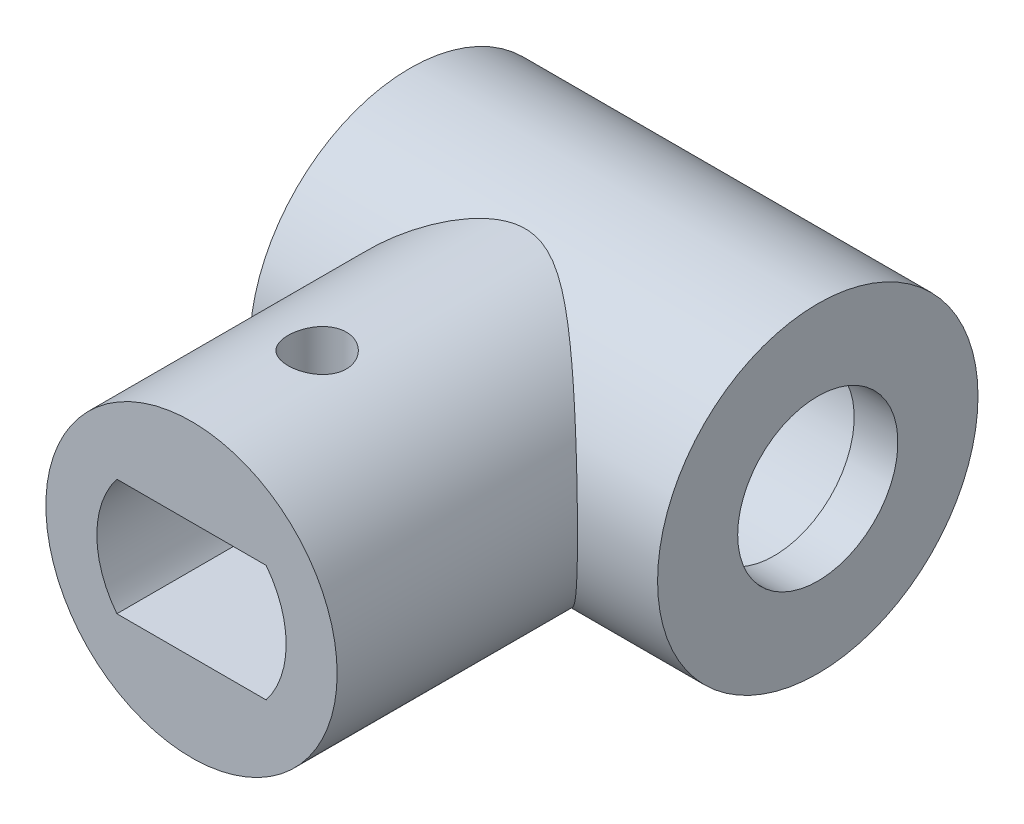
ISO-10303-21;
HEADER;
FILE_DESCRIPTION(('STEP AP214'),'2;1');
FILE_NAME('part.step','',(''),(''),'','','');
FILE_SCHEMA(('AUTOMOTIVE_DESIGN { 1 0 10303 214 1 1 1 1 }'));
ENDSEC;
DATA;
#1=APPLICATION_CONTEXT('core data for automotive mechanical design processes');
#2=APPLICATION_PROTOCOL_DEFINITION('international standard','automotive_design',2000,#1);
#3=PRODUCT_CONTEXT('',#1,'mechanical');
#4=PRODUCT('Part','Part','',(#3));
#5=PRODUCT_RELATED_PRODUCT_CATEGORY('part','',(#4));
#6=PRODUCT_DEFINITION_FORMATION('','',#4);
#7=PRODUCT_DEFINITION_CONTEXT('part definition',#1,'design');
#8=PRODUCT_DEFINITION('design','',#6,#7);
#9=PRODUCT_DEFINITION_SHAPE('','',#8);
#10=(LENGTH_UNIT() NAMED_UNIT(*) SI_UNIT(.MILLI.,.METRE.));
#11=(NAMED_UNIT(*) PLANE_ANGLE_UNIT() SI_UNIT($,.RADIAN.));
#12=(NAMED_UNIT(*) SI_UNIT($,.STERADIAN.) SOLID_ANGLE_UNIT());
#13=UNCERTAINTY_MEASURE_WITH_UNIT(LENGTH_MEASURE(1.E-05),#10,'distance_accuracy_value','');
#14=(GEOMETRIC_REPRESENTATION_CONTEXT(3) GLOBAL_UNCERTAINTY_ASSIGNED_CONTEXT((#13)) GLOBAL_UNIT_ASSIGNED_CONTEXT((#10,
#11,#12)) REPRESENTATION_CONTEXT('',''));
#15=CARTESIAN_POINT('',(0.,0.,0.));
#16=DIRECTION('',(0.,0.,1.));
#17=DIRECTION('',(1.,0.,0.));
#18=AXIS2_PLACEMENT_3D('',#15,#16,#17);
#19=CARTESIAN_POINT('',(10.,3.2,0.));
#20=DIRECTION('',(1.,0.,0.));
#21=DIRECTION('',(0.,0.,-1.));
#22=AXIS2_PLACEMENT_3D('',#19,#20,#21);
#23=PLANE('',#22);
#24=CARTESIAN_POINT('',(10.,0.,0.));
#25=DIRECTION('',(-1.,0.,0.));
#26=DIRECTION('',(0.,0.,1.));
#27=AXIS2_PLACEMENT_3D('',#24,#25,#26);
#28=CIRCLE('',#27,2.2);
#29=CARTESIAN_POINT('',(10.,0.,2.2));
#30=VERTEX_POINT('',#29);
#31=EDGE_CURVE('E109',#30,#30,#28,.T.);
#32=ORIENTED_EDGE('',*,*,#31,.F.);
#33=EDGE_LOOP('',(#32));
#34=FACE_BOUND('',#33,.T.);
#35=CARTESIAN_POINT('',(10.,0.,0.));
#36=DIRECTION('',(-1.,0.,0.));
#37=DIRECTION('',(0.,0.,1.));
#38=AXIS2_PLACEMENT_3D('',#35,#36,#37);
#39=CIRCLE('',#38,3.2);
#40=CARTESIAN_POINT('',(10.,0.,3.2));
#41=VERTEX_POINT('',#40);
#42=EDGE_CURVE('E50',#41,#41,#39,.T.);
#43=ORIENTED_EDGE('',*,*,#42,.T.);
#44=EDGE_LOOP('',(#43));
#45=FACE_BOUND('',#44,.T.);
#46=ADVANCED_FACE('F40',(#34,#45),#23,.F.);
#47=CARTESIAN_POINT('',(0.,0.,0.));
#48=DIRECTION('',(-1.,0.,0.));
#49=DIRECTION('',(0.,0.,1.));
#50=AXIS2_PLACEMENT_3D('',#47,#48,#49);
#51=CYLINDRICAL_SURFACE('',#50,3.2);
#52=ORIENTED_EDGE('',*,*,#42,.F.);
#53=EDGE_LOOP('',(#52));
#54=FACE_BOUND('',#53,.T.);
#55=CARTESIAN_POINT('',(0.,0.,0.));
#56=DIRECTION('',(-1.,0.,0.));
#57=DIRECTION('',(0.,0.,1.));
#58=AXIS2_PLACEMENT_3D('',#55,#56,#57);
#59=CIRCLE('',#58,3.2);
#60=CARTESIAN_POINT('',(0.,0.,3.2));
#61=VERTEX_POINT('',#60);
#62=EDGE_CURVE('E168',#61,#61,#59,.T.);
#63=ORIENTED_EDGE('',*,*,#62,.T.);
#64=EDGE_LOOP('',(#63));
#65=FACE_BOUND('',#64,.T.);
#66=ADVANCED_FACE('F155',(#54,#65),#51,.F.);
#67=CARTESIAN_POINT('',(0.,3.2,0.));
#68=DIRECTION('',(-1.,0.,0.));
#69=DIRECTION('',(0.,0.,1.));
#70=AXIS2_PLACEMENT_3D('',#67,#68,#69);
#71=PLANE('',#70);
#72=CARTESIAN_POINT('',(0.,0.,0.));
#73=DIRECTION('',(-1.,0.,0.));
#74=DIRECTION('',(0.,0.,1.));
#75=AXIS2_PLACEMENT_3D('',#72,#73,#74);
#76=CIRCLE('',#75,4.4);
#77=CARTESIAN_POINT('',(0.,0.,4.4));
#78=VERTEX_POINT('',#77);
#79=EDGE_CURVE('E170',#78,#78,#76,.T.);
#80=ORIENTED_EDGE('',*,*,#79,.T.);
#81=EDGE_LOOP('',(#80));
#82=FACE_BOUND('',#81,.T.);
#83=ORIENTED_EDGE('',*,*,#62,.F.);
#84=EDGE_LOOP('',(#83));
#85=FACE_BOUND('',#84,.T.);
#86=ADVANCED_FACE('F131',(#82,#85),#71,.T.);
#87=CARTESIAN_POINT('',(0.,0.,0.));
#88=DIRECTION('',(-1.,0.,0.));
#89=DIRECTION('',(0.,0.,1.));
#90=AXIS2_PLACEMENT_3D('',#87,#88,#89);
#91=CYLINDRICAL_SURFACE('',#90,4.4);
#92=CARTESIAN_POINT('',(9.,0.,4.4));
#93=CARTESIAN_POINT('',(9.00000495667873,0.0924269355025383,4.40000487554974));
#94=CARTESIAN_POINT('',(8.99679350954436,0.18481759342677,4.39708449044668));
#95=CARTESIAN_POINT('',(8.98402601144917,0.368824682531485,4.38548234541791));
#96=CARTESIAN_POINT('',(8.97446893648811,0.460440986336781,4.3767996556235));
#97=CARTESIAN_POINT('',(8.94918506170048,0.642150203798754,4.35385282207964));
#98=CARTESIAN_POINT('',(8.93345523871402,0.732242348397674,4.33958594343141));
#99=CARTESIAN_POINT('',(8.89612678439834,0.91020867294481,4.30578013660612));
#100=CARTESIAN_POINT('',(8.87452549261995,0.998081827661333,4.28623881853081));
#101=CARTESIAN_POINT('',(8.80177592714933,1.25628176701697,4.22055181527461));
#102=CARTESIAN_POINT('',(8.74248074890675,1.42257729311757,4.16715916954274));
#103=CARTESIAN_POINT('',(8.60548366308125,1.74087321231155,4.04457517900178));
#104=CARTESIAN_POINT('',(8.52777444437521,1.89286789381416,3.97537755937022));
#105=CARTESIAN_POINT('',(8.32292227946022,2.23900871905591,3.79454870101168));
#106=CARTESIAN_POINT('',(8.18842773497526,2.42576883801984,3.67700386984987));
#107=CARTESIAN_POINT('',(7.96938978052159,2.68243611206565,3.48939430587899));
#108=CARTESIAN_POINT('',(7.89335840467134,2.76419200698777,3.42486300971561));
#109=CARTESIAN_POINT('',(7.73599897160089,2.92002610414236,3.29299858995467));
#110=CARTESIAN_POINT('',(7.6546715943739,2.99410528889232,3.22566582645771));
#111=CARTESIAN_POINT('',(7.48511227855945,3.13636199545127,3.08760406382723));
#112=CARTESIAN_POINT('',(7.39676152472282,3.20435536413892,3.01683234144542));
#113=CARTESIAN_POINT('',(7.21508012714858,3.33253354284147,2.87460919904179));
#114=CARTESIAN_POINT('',(7.12174936606444,3.3927181687401,2.80315776303616));
#115=CARTESIAN_POINT('',(6.93016767862329,3.50525024803966,2.6610925753316));
#116=CARTESIAN_POINT('',(6.83192540092348,3.55761087204853,2.59047760440101));
#117=CARTESIAN_POINT('',(6.62999172940966,3.65454066417509,2.45183042203371));
#118=CARTESIAN_POINT('',(6.52630358773336,3.69911441513778,2.38379671002011));
#119=CARTESIAN_POINT('',(6.3141168034587,3.77965649248952,2.25387373413747));
#120=CARTESIAN_POINT('',(6.2057064661075,3.8157371633984,2.19191143425386));
#121=CARTESIAN_POINT('',(5.98165079486313,3.87942158891921,2.07710856947748));
#122=CARTESIAN_POINT('',(5.86600903666079,3.90702949374674,2.02426354424131));
#123=CARTESIAN_POINT('',(5.64707623733092,3.9486060038683,1.94172373368419));
#124=CARTESIAN_POINT('',(5.54501640399168,3.96409364479991,1.90962279768158));
#125=CARTESIAN_POINT('',(5.33651697671554,3.98718922621181,1.86093425906485));
#126=CARTESIAN_POINT('',(5.23009229122748,3.99482198818969,1.84429780475175));
#127=CARTESIAN_POINT('',(5.01473966922593,4.00143072944787,1.82992903676676));
#128=CARTESIAN_POINT('',(4.90579844715615,4.00033618087491,1.83235073534894));
#129=CARTESIAN_POINT('',(4.69032378500602,3.98946250343548,1.8558896103991));
#130=CARTESIAN_POINT('',(4.58379618339676,3.97966423148248,1.87704799627222));
#131=CARTESIAN_POINT('',(4.33946134066213,3.94763056562593,1.94369616923829));
#132=CARTESIAN_POINT('',(4.20376591095734,3.92224117305064,1.99511225323542));
#133=CARTESIAN_POINT('',(3.94191829740211,3.85988667568206,2.1132312285633));
#134=CARTESIAN_POINT('',(3.81580717598237,3.82287490646056,2.17999544868622));
#135=CARTESIAN_POINT('',(3.57595781433542,3.74000358070732,2.31921273580782));
#136=CARTESIAN_POINT('',(3.46194841026877,3.69447684812075,2.39140488068801));
#137=CARTESIAN_POINT('',(3.24047444311271,3.59428058848201,2.5395194803184));
#138=CARTESIAN_POINT('',(3.13301524739139,3.53960369743495,2.61544490455337));
#139=CARTESIAN_POINT('',(2.92392028051076,3.42116081304487,2.76858309299831));
#140=CARTESIAN_POINT('',(2.82229316664769,3.35738177380728,2.84579756202553));
#141=CARTESIAN_POINT('',(2.62487189864361,3.22074060729745,2.9995686315408));
#142=CARTESIAN_POINT('',(2.52907597988416,3.14788124842788,3.07612542496874));
#143=CARTESIAN_POINT('',(2.33805074603652,2.98837666954528,3.23151903649429));
#144=CARTESIAN_POINT('',(2.24317989580438,2.9011754504952,3.31022866700619));
#145=CARTESIAN_POINT('',(2.06072426926884,2.71616308660379,3.46365557819293));
#146=CARTESIAN_POINT('',(1.97314156715997,2.61834893946492,3.53837172017834));
#147=CARTESIAN_POINT('',(1.80655123653238,2.41233478018047,3.68189292703265));
#148=CARTESIAN_POINT('',(1.72751560404867,2.30417101850617,3.75071713183785));
#149=CARTESIAN_POINT('',(1.57906887785961,2.07740274916348,3.88091515048026));
#150=CARTESIAN_POINT('',(1.50965052635416,1.95880622644238,3.94229457820671));
#151=CARTESIAN_POINT('',(1.36656052738161,1.68162166443115,4.06946661470496));
#152=CARTESIAN_POINT('',(1.29587708492558,1.52027294779555,4.13277388417316));
#153=CARTESIAN_POINT('',(1.20539397604715,1.26844588164932,4.21412686239755));
#154=CARTESIAN_POINT('',(1.17781938390443,1.18285170735497,4.23898008717018));
#155=CARTESIAN_POINT('',(1.12824806362905,1.00881475714988,4.28373063906397));
#156=CARTESIAN_POINT('',(1.10624873030752,0.920373333547553,4.30363028080188));
#157=CARTESIAN_POINT('',(1.06806509192615,0.740540970068422,4.33820772698532));
#158=CARTESIAN_POINT('',(1.05192429243594,0.649133243278533,4.3528464562056));
#159=CARTESIAN_POINT('',(1.02599773157315,0.464725161600254,4.37637570031014));
#160=CARTESIAN_POINT('',(1.0162091368461,0.37172553579214,4.38526877799244));
#161=CARTESIAN_POINT('',(1.00317873940519,0.184898335577167,4.39710959411491));
#162=CARTESIAN_POINT('',(0.999936349759784,0.0910708361550037,4.40005786556528));
#163=CARTESIAN_POINT('',(1.00006554058709,-0.0965704375403817,4.39994041593773));
#164=CARTESIAN_POINT('',(1.00343661374991,-0.190384212314343,4.39687515614974));
#165=CARTESIAN_POINT('',(1.0160533625176,-0.367780730560153,4.38541043170609));
#166=CARTESIAN_POINT('',(1.02467554325451,-0.451445400618304,4.37757715055996));
#167=CARTESIAN_POINT('',(1.04706422291375,-0.617521237121477,4.35725600960193));
#168=CARTESIAN_POINT('',(1.06083242779959,-0.699931978436131,4.34476660623791));
#169=CARTESIAN_POINT('',(1.1095493825725,-0.944423116664726,4.30062915466082));
#170=CARTESIAN_POINT('',(1.15192139917521,-1.10390911935219,4.26230185895657));
#171=CARTESIAN_POINT('',(1.25596553695522,-1.41796703910068,4.1686043796883));
#172=CARTESIAN_POINT('',(1.31828645747675,-1.57214630351034,4.1126624929313));
#173=CARTESIAN_POINT('',(1.45876141031402,-1.86717957911624,3.98740155055454));
#174=CARTESIAN_POINT('',(1.5369222052489,-2.00802786102409,3.91807678189679));
#175=CARTESIAN_POINT('',(1.75010845314288,-2.34428955000488,3.73067943868791));
#176=CARTESIAN_POINT('',(1.89372207953599,-2.53057443649464,3.6058567003314));
#177=CARTESIAN_POINT('',(2.12672647231955,-2.78525260185442,3.40793795579186));
#178=CARTESIAN_POINT('',(2.20750102553534,-2.86615464302839,3.34004057279201));
#179=CARTESIAN_POINT('',(2.37447770621724,-3.01984956548747,3.20174469328733));
#180=CARTESIAN_POINT('',(2.46067887933357,-3.09264386643508,3.13134663750568));
#181=CARTESIAN_POINT('',(2.64029935988816,-3.23187932039177,2.98751047176767));
#182=CARTESIAN_POINT('',(2.73384204852755,-3.29812671303548,2.91403992788473));
#183=CARTESIAN_POINT('',(2.92627341578207,-3.42239426527572,2.76703371847698));
#184=CARTESIAN_POINT('',(3.02516421030981,-3.48041113518645,2.693498038668));
#185=CARTESIAN_POINT('',(3.22829528874312,-3.58807061953613,2.54831135898672));
#186=CARTESIAN_POINT('',(3.33252173948388,-3.63773358743054,2.47665614826272));
#187=CARTESIAN_POINT('',(3.54716453559291,-3.72865238232166,2.33752683398575));
#188=CARTESIAN_POINT('',(3.65757496393775,-3.76991607651709,2.2700488594336));
#189=CARTESIAN_POINT('',(3.87343095981072,-3.83956721965323,2.14988630533705));
#190=CARTESIAN_POINT('',(3.97812171245154,-3.86886467157386,2.09639106730601));
#191=CARTESIAN_POINT('',(4.19414012779336,-3.91954808817382,2.00002525600547));
#192=CARTESIAN_POINT('',(4.30545730620417,-3.94094618410311,1.9571384248309));
#193=CARTESIAN_POINT('',(4.51579510235235,-3.9717605502752,1.89371899125559));
#194=CARTESIAN_POINT('',(4.6138205299757,-3.98256994927218,1.87066771801757));
#195=CARTESIAN_POINT('',(4.81270907179516,-3.99684932204305,1.83997481130789));
#196=CARTESIAN_POINT('',(4.91356552650548,-4.00033526108255,1.8322996593338));
#197=CARTESIAN_POINT('',(5.11533385084094,-3.99961254406865,1.8338747908906));
#198=CARTESIAN_POINT('',(5.21624535352724,-3.9953869290163,1.84316237836171));
#199=CARTESIAN_POINT('',(5.41499256829596,-3.97967036837905,1.87684582282375));
#200=CARTESIAN_POINT('',(5.51282087455589,-3.9681631496967,1.90127551723667));
#201=CARTESIAN_POINT('',(5.75900059507491,-3.93029391542531,1.97876239903435));
#202=CARTESIAN_POINT('',(5.90388785115783,-3.89919061169443,2.04020460450053));
#203=CARTESIAN_POINT('',(6.18283170874697,-3.82386594575618,2.17813603587533));
#204=CARTESIAN_POINT('',(6.31683654409792,-3.77958608243236,2.25469184172399));
#205=CARTESIAN_POINT('',(6.5676609619916,-3.68230077549113,2.41009898833192));
#206=CARTESIAN_POINT('',(6.68503076547285,-3.6300029870555,2.48851666052581));
#207=CARTESIAN_POINT('',(6.91285552403752,-3.51529016731161,2.64809562404767));
#208=CARTESIAN_POINT('',(7.02330510487279,-3.4528674047052,2.72925897415834));
#209=CARTESIAN_POINT('',(7.23766095747566,-3.31796476204479,2.89175799472706));
#210=CARTESIAN_POINT('',(7.34157014225564,-3.24548940603613,2.9730935715521));
#211=CARTESIAN_POINT('',(7.54279262558137,-3.09036099949414,3.13403338242103));
#212=CARTESIAN_POINT('',(7.64010903536682,-3.00771280230163,3.21363842091846));
#213=CARTESIAN_POINT('',(7.8863819176057,-2.77712581526404,3.41817903147976));
#214=CARTESIAN_POINT('',(8.0297152591245,-2.62060191171436,3.54044026760282));
#215=CARTESIAN_POINT('',(8.2938986351855,-2.27959277165559,3.76901199890338));
#216=CARTESIAN_POINT('',(8.41479027968337,-2.09516045785005,3.87535194200721));
#217=CARTESIAN_POINT('',(8.60452770943954,-1.743018111132,4.0436568270632));
#218=CARTESIAN_POINT('',(8.67897246962466,-1.58055336019513,4.11023750359587));
#219=CARTESIAN_POINT('',(8.80677085525828,-1.24144013227172,4.22501013045973));
#220=CARTESIAN_POINT('',(8.86015370249206,-1.06481171886217,4.2732275551406));
#221=CARTESIAN_POINT('',(8.93363785096296,-0.740281114822037,4.33973766405323));
#222=CARTESIAN_POINT('',(8.95840756537768,-0.594279747553489,4.36221796159953));
#223=CARTESIAN_POINT('',(8.99158437010578,-0.298820599321929,4.39234495007653));
#224=CARTESIAN_POINT('',(8.99999198995341,-0.149362930375264,4.39999212105873));
#225=CARTESIAN_POINT('',(9.,0.,4.4));
#226=B_SPLINE_CURVE_WITH_KNOTS('',3,(#92,#93,#94,#95,#96,#97,#98,#99,#100,#101,#102,#103,#104,
#105,#106,#107,#108,#109,#110,#111,#112,#113,#114,#115,#116,#117,#118,#119,#120,#121,#122,#123,
#124,#125,#126,#127,#128,#129,#130,#131,#132,#133,#134,#135,#136,#137,#138,#139,#140,#141,#142,
#143,#144,#145,#146,#147,#148,#149,#150,#151,#152,#153,#154,#155,#156,#157,#158,#159,#160,#161,
#162,#163,#164,#165,#166,#167,#168,#169,#170,#171,#172,#173,#174,#175,#176,#177,#178,#179,#180,
#181,#182,#183,#184,#185,#186,#187,#188,#189,#190,#191,#192,#193,#194,#195,#196,#197,#198,#199,
#200,#201,#202,#203,#204,#205,#206,#207,#208,#209,#210,#211,#212,#213,#214,#215,#216,#217,#218,
#219,#220,#221,#222,#223,#224,#225),.UNSPECIFIED.,.T.,.F.,(4,2,2,2,2,2,2,2,2,2,2,2,2,2,2,2,2,2,
2,2,2,2,2,2,2,2,2,2,2,2,2,2,2,2,2,2,2,2,2,2,2,2,2,2,2,2,2,2,2,2,2,2,2,2,2,2,2,2,2,2,2,2,2,2,2,2,
4),(0.,0.277116880383664,0.554278490263938,0.831576012333312,1.10899939206551,1.65965833558117,
2.21053628051705,2.98126152333631,3.36786747253348,3.75442388000614,4.15025124788179,
4.54608794696799,4.94125061648441,5.33617992976927,5.72554773953951,6.11472451971238,
6.43790341507293,6.76005789642564,7.08481842156452,7.41029500282923,7.84976393651114,
8.29102042071044,8.71769429519995,9.14471322044245,9.57235044593278,9.99985761111959,
10.4522823264123,10.9048353637524,11.3558575928731,11.8065375765033,12.3655433986883,
12.6451564488098,12.9246386003382,13.2061556659246,13.4875470764169,13.7689132562865,
14.0502578537768,14.3033681727108,14.5565624750256,15.0625141708781,15.5869579454646,
16.1116260976852,16.905760962628,17.3043948162966,17.7029587592168,18.1110621300868,
18.519328160373,18.9265846125185,19.3334578336605,19.6963200260927,20.0586226201144,
20.3612415827705,20.6632001435091,20.9658235620866,21.2691256906698,21.7476571222824,
22.2283456614698,22.6793513883183,23.1307031326772,23.5818524068747,24.0327872714097,
24.7648071522763,25.4954559080871,26.0653884797356,26.6345275094434,27.0823658880222,
27.5301897727535),.UNSPECIFIED.);
#227=CARTESIAN_POINT('',(9.,0.,4.4));
#228=VERTEX_POINT('',#227);
#229=EDGE_CURVE('E12',#228,#228,#226,.T.);
#230=ORIENTED_EDGE('',*,*,#229,.F.);
#231=EDGE_LOOP('',(#230));
#232=FACE_BOUND('',#231,.T.);
#233=CARTESIAN_POINT('',(11.2,0.,0.));
#234=DIRECTION('',(-1.,0.,0.));
#235=DIRECTION('',(0.,0.,1.));
#236=AXIS2_PLACEMENT_3D('',#233,#234,#235);
#237=CIRCLE('',#236,4.4);
#238=CARTESIAN_POINT('',(11.2,0.,4.4));
#239=VERTEX_POINT('',#238);
#240=EDGE_CURVE('E173',#239,#239,#237,.T.);
#241=ORIENTED_EDGE('',*,*,#240,.T.);
#242=EDGE_LOOP('',(#241));
#243=FACE_BOUND('',#242,.T.);
#244=ORIENTED_EDGE('',*,*,#79,.F.);
#245=EDGE_LOOP('',(#244));
#246=FACE_BOUND('',#245,.T.);
#247=ADVANCED_FACE('F125',(#232,#243,#246),#91,.T.);
#248=CARTESIAN_POINT('',(11.2,3.2,0.));
#249=DIRECTION('',(1.,0.,0.));
#250=DIRECTION('',(0.,0.,-1.));
#251=AXIS2_PLACEMENT_3D('',#248,#249,#250);
#252=PLANE('',#251);
#253=CARTESIAN_POINT('',(11.2,0.,0.));
#254=DIRECTION('',(-1.,0.,0.));
#255=DIRECTION('',(0.,0.,1.));
#256=AXIS2_PLACEMENT_3D('',#253,#254,#255);
#257=CIRCLE('',#256,2.2);
#258=CARTESIAN_POINT('',(11.2,0.,2.2));
#259=VERTEX_POINT('',#258);
#260=EDGE_CURVE('E178',#259,#259,#257,.T.);
#261=ORIENTED_EDGE('',*,*,#260,.T.);
#262=EDGE_LOOP('',(#261));
#263=FACE_BOUND('',#262,.T.);
#264=ORIENTED_EDGE('',*,*,#240,.F.);
#265=EDGE_LOOP('',(#264));
#266=FACE_BOUND('',#265,.T.);
#267=ADVANCED_FACE('F130',(#263,#266),#252,.T.);
#268=CARTESIAN_POINT('',(0.,0.,0.));
#269=DIRECTION('',(-1.,0.,0.));
#270=DIRECTION('',(0.,0.,1.));
#271=AXIS2_PLACEMENT_3D('',#268,#269,#270);
#272=CYLINDRICAL_SURFACE('',#271,2.2);
#273=ORIENTED_EDGE('',*,*,#31,.T.);
#274=EDGE_LOOP('',(#273));
#275=FACE_BOUND('',#274,.T.);
#276=ORIENTED_EDGE('',*,*,#260,.F.);
#277=EDGE_LOOP('',(#276));
#278=FACE_BOUND('',#277,.T.);
#279=ADVANCED_FACE('F153',(#275,#278),#272,.F.);
#280=CARTESIAN_POINT('',(5.,0.,-4.401));
#281=DIRECTION('',(0.,0.,1.));
#282=DIRECTION('',(1.,0.,0.));
#283=AXIS2_PLACEMENT_3D('',#280,#281,#282);
#284=CYLINDRICAL_SURFACE('',#283,2.6);
#285=DIRECTION('',(0.,0.,1.));
#286=VECTOR('',#285,1.);
#287=CARTESIAN_POINT('',(2.95060984680808,-1.6,4.09878030638384));
#288=LINE('',#287,#286);
#289=CARTESIAN_POINT('',(2.95060984680808,-1.6,4.09878030638384));
#290=VERTEX_POINT('',#289);
#291=CARTESIAN_POINT('',(2.95060984680808,-1.6,11.));
#292=VERTEX_POINT('',#291);
#293=EDGE_CURVE('E82',#290,#292,#288,.T.);
#294=ORIENTED_EDGE('',*,*,#293,.F.);
#295=CARTESIAN_POINT('',(2.95060984680808,-1.6,4.09878030638384));
#296=CARTESIAN_POINT('',(2.90923444338961,-1.54699439474211,4.11947212715025));
#297=CARTESIAN_POINT('',(2.86982294511351,-1.49228060958251,4.1396432457573));
#298=CARTESIAN_POINT('',(2.79514421776486,-1.37956380095587,4.17856026760957));
#299=CARTESIAN_POINT('',(2.75987957720697,-1.32155875618312,4.19730527811241));
#300=CARTESIAN_POINT('',(2.6604784387689,-1.14249215710313,4.25090877287651));
#301=CARTESIAN_POINT('',(2.60302151488477,-1.01674431464653,4.28298852303423));
#302=CARTESIAN_POINT('',(2.5081830315731,-0.755169717380691,4.33677486866732));
#303=CARTESIAN_POINT('',(2.47088431435934,-0.619303943430849,4.35843861890496));
#304=CARTESIAN_POINT('',(2.41878186252541,-0.342199335925727,4.38887593163895));
#305=CARTESIAN_POINT('',(2.40391971892003,-0.200975438268,4.39768296196831));
#306=CARTESIAN_POINT('',(2.39770412300276,0.0705298016136173,4.40135749157658));
#307=CARTESIAN_POINT('',(2.4045229620477,0.200758885056573,4.39730877183339));
#308=CARTESIAN_POINT('',(2.43737468579625,0.458012796875663,4.37799862313215));
#309=CARTESIAN_POINT('',(2.463423718679,0.585034839436212,4.3627277706567));
#310=CARTESIAN_POINT('',(2.53282521406671,0.830055173518156,4.32275000817822));
#311=CARTESIAN_POINT('',(2.57585502734821,0.948175404822893,4.29821939911512));
#312=CARTESIAN_POINT('',(2.6775484797056,1.17545868550931,4.24169736067856));
#313=CARTESIAN_POINT('',(2.7362010398704,1.28462801097783,4.20971122041447));
#314=CARTESIAN_POINT('',(2.82490646412353,1.42508015532804,4.16300953006335));
#315=CARTESIAN_POINT('',(2.84891676969947,1.46106422454808,4.15050657146716));
#316=CARTESIAN_POINT('',(2.8985552874343,1.53159447987263,4.12499908699579));
#317=CARTESIAN_POINT('',(2.9241800625171,1.56614347704075,4.1119956481472));
#318=CARTESIAN_POINT('',(2.95060984680788,1.60000000000012,4.09878030638383));
#319=B_SPLINE_CURVE_WITH_KNOTS('',3,(#295,#296,#297,#298,#299,#300,#301,#302,#303,#304,#305,
#306,#307,#308,#309,#310,#311,#312,#313,#314,#315,#316,#317,#318),.UNSPECIFIED.,.F.,.F.,(4,2,2,
2,2,2,2,2,2,2,2,4),(0.,0.210961628004559,0.422054249334481,0.845684387947083,1.2710424895631,
1.69529133804845,2.08475321025071,2.47454249798571,2.85725687864827,3.2397005756844,
3.37475113975059,3.50952331885968),.UNSPECIFIED.);
#320=CARTESIAN_POINT('',(2.95060984680808,1.6,4.09878030638384));
#321=VERTEX_POINT('',#320);
#322=EDGE_CURVE('E59',#290,#321,#319,.T.);
#323=ORIENTED_EDGE('',*,*,#322,.T.);
#324=DIRECTION('',(0.,0.,1.));
#325=VECTOR('',#324,1.);
#326=CARTESIAN_POINT('',(2.95060984680808,1.6,4.09878030638384));
#327=LINE('',#326,#325);
#328=CARTESIAN_POINT('',(2.95060984680808,1.6,11.));
#329=VERTEX_POINT('',#328);
#330=EDGE_CURVE('E93',#321,#329,#327,.T.);
#331=ORIENTED_EDGE('',*,*,#330,.T.);
#332=CARTESIAN_POINT('',(5.,0.,11.));
#333=DIRECTION('',(0.,0.,1.));
#334=DIRECTION('',(1.,0.,0.));
#335=AXIS2_PLACEMENT_3D('',#332,#333,#334);
#336=CIRCLE('',#335,2.6);
#337=EDGE_CURVE('E91',#329,#292,#336,.T.);
#338=ORIENTED_EDGE('',*,*,#337,.T.);
#339=EDGE_LOOP('',(#294,#323,#331,#338));
#340=FACE_BOUND('',#339,.T.);
#341=ADVANCED_FACE('F92',(#340),#284,.F.);
#342=CARTESIAN_POINT('',(5.,0.,-4.401));
#343=DIRECTION('',(0.,0.,1.));
#344=DIRECTION('',(1.,0.,0.));
#345=AXIS2_PLACEMENT_3D('',#342,#343,#344);
#346=CYLINDRICAL_SURFACE('',#345,2.6);
#347=DIRECTION('',(0.,0.,1.));
#348=VECTOR('',#347,1.);
#349=CARTESIAN_POINT('',(7.04939015319192,1.6,4.09878030638384));
#350=LINE('',#349,#348);
#351=CARTESIAN_POINT('',(7.04939015319192,1.6,4.09878030638384));
#352=VERTEX_POINT('',#351);
#353=CARTESIAN_POINT('',(7.04939015319192,1.6,11.));
#354=VERTEX_POINT('',#353);
#355=EDGE_CURVE('E110',#352,#354,#350,.T.);
#356=ORIENTED_EDGE('',*,*,#355,.F.);
#357=CARTESIAN_POINT('',(7.04939015319192,1.6,4.09878030638384));
#358=CARTESIAN_POINT('',(7.09076555661039,1.54699439474211,4.11947212715025));
#359=CARTESIAN_POINT('',(7.13017705488649,1.49228060958251,4.1396432457573));
#360=CARTESIAN_POINT('',(7.20485578223514,1.37956380095587,4.17856026760957));
#361=CARTESIAN_POINT('',(7.24012042279303,1.32155875618312,4.19730527811241));
#362=CARTESIAN_POINT('',(7.3395215612311,1.14249215710313,4.25090877287651));
#363=CARTESIAN_POINT('',(7.39697848511523,1.01674431464653,4.28298852303423));
#364=CARTESIAN_POINT('',(7.4918169684269,0.755169717380691,4.33677486866732));
#365=CARTESIAN_POINT('',(7.52911568564066,0.619303943430849,4.35843861890496));
#366=CARTESIAN_POINT('',(7.58121813747459,0.342199335925728,4.38887593163895));
#367=CARTESIAN_POINT('',(7.59608028107997,0.200975438267999,4.39768296196831));
#368=CARTESIAN_POINT('',(7.60229587699724,-0.0705298016136176,4.40135749157658));
#369=CARTESIAN_POINT('',(7.5954770379523,-0.200758885056574,4.39730877183339));
#370=CARTESIAN_POINT('',(7.56262531420375,-0.458012796875664,4.37799862313215));
#371=CARTESIAN_POINT('',(7.536576281321,-0.585034839436212,4.3627277706567));
#372=CARTESIAN_POINT('',(7.46717478593329,-0.830055173518157,4.32275000817822));
#373=CARTESIAN_POINT('',(7.42414497265179,-0.948175404822893,4.29821939911512));
#374=CARTESIAN_POINT('',(7.3224515202944,-1.17545868550931,4.24169736067856));
#375=CARTESIAN_POINT('',(7.2637989601296,-1.28462801097783,4.20971122041447));
#376=CARTESIAN_POINT('',(7.17509353587647,-1.42508015532804,4.16300953006335));
#377=CARTESIAN_POINT('',(7.15108323030053,-1.46106422454808,4.15050657146716));
#378=CARTESIAN_POINT('',(7.1014447125657,-1.53159447987263,4.12499908699579));
#379=CARTESIAN_POINT('',(7.0758199374829,-1.56614347704075,4.1119956481472));
#380=CARTESIAN_POINT('',(7.04939015319212,-1.60000000000012,4.09878030638383));
#381=B_SPLINE_CURVE_WITH_KNOTS('',3,(#357,#358,#359,#360,#361,#362,#363,#364,#365,#366,#367,
#368,#369,#370,#371,#372,#373,#374,#375,#376,#377,#378,#379,#380),.UNSPECIFIED.,.F.,.F.,(4,2,2,
2,2,2,2,2,2,2,2,4),(0.,0.210961628004559,0.422054249334482,0.845684387947083,1.2710424895631,
1.69529133804846,2.08475321025071,2.47454249798571,2.85725687864827,3.2397005756844,
3.37475113975059,3.50952331885968),.UNSPECIFIED.);
#382=CARTESIAN_POINT('',(7.04939015319192,-1.6,4.09878030638384));
#383=VERTEX_POINT('',#382);
#384=EDGE_CURVE('E97',#352,#383,#381,.T.);
#385=ORIENTED_EDGE('',*,*,#384,.T.);
#386=DIRECTION('',(0.,0.,1.));
#387=VECTOR('',#386,1.);
#388=CARTESIAN_POINT('',(7.04939015319192,-1.6,4.09878030638384));
#389=LINE('',#388,#387);
#390=CARTESIAN_POINT('',(7.04939015319192,-1.6,11.));
#391=VERTEX_POINT('',#390);
#392=EDGE_CURVE('E77',#383,#391,#389,.T.);
#393=ORIENTED_EDGE('',*,*,#392,.T.);
#394=CARTESIAN_POINT('',(5.,0.,11.));
#395=DIRECTION('',(0.,0.,1.));
#396=DIRECTION('',(1.,0.,0.));
#397=AXIS2_PLACEMENT_3D('',#394,#395,#396);
#398=CIRCLE('',#397,2.6);
#399=EDGE_CURVE('E101',#391,#354,#398,.T.);
#400=ORIENTED_EDGE('',*,*,#399,.T.);
#401=EDGE_LOOP('',(#356,#385,#393,#400));
#402=FACE_BOUND('',#401,.T.);
#403=ADVANCED_FACE('F122',(#402),#346,.F.);
#404=CARTESIAN_POINT('',(3.,-1.6,-4.401));
#405=DIRECTION('',(0.,-1.,0.));
#406=DIRECTION('',(0.,0.,-1.));
#407=AXIS2_PLACEMENT_3D('',#404,#405,#406);
#408=PLANE('',#407);
#409=CARTESIAN_POINT('',(5.,-1.6,7.54939015319192));
#410=DIRECTION('',(0.,-1.,0.));
#411=DIRECTION('',(0.,0.,-1.));
#412=AXIS2_PLACEMENT_3D('',#409,#410,#411);
#413=CIRCLE('',#412,0.800000000000001);
#414=CARTESIAN_POINT('',(5.,-1.6,6.74939015319192));
#415=VERTEX_POINT('',#414);
#416=EDGE_CURVE('E148',#415,#415,#413,.T.);
#417=ORIENTED_EDGE('',*,*,#416,.T.);
#418=EDGE_LOOP('',(#417));
#419=FACE_BOUND('',#418,.T.);
#420=ORIENTED_EDGE('',*,*,#392,.F.);
#421=DIRECTION('',(-1.,0.,0.));
#422=VECTOR('',#421,1.);
#423=CARTESIAN_POINT('',(7.04939015319192,-1.6,4.09878030638384));
#424=LINE('',#423,#422);
#425=EDGE_CURVE('E88',#383,#290,#424,.T.);
#426=ORIENTED_EDGE('',*,*,#425,.T.);
#427=ORIENTED_EDGE('',*,*,#293,.T.);
#428=DIRECTION('',(1.,0.,0.));
#429=VECTOR('',#428,1.);
#430=CARTESIAN_POINT('',(5.,-1.6,11.));
#431=LINE('',#430,#429);
#432=EDGE_CURVE('E85',#292,#391,#431,.T.);
#433=ORIENTED_EDGE('',*,*,#432,.T.);
#434=EDGE_LOOP('',(#420,#426,#427,#433));
#435=FACE_BOUND('',#434,.T.);
#436=ADVANCED_FACE('F42',(#419,#435),#408,.F.);
#437=CARTESIAN_POINT('',(5.,0.,-4.401));
#438=DIRECTION('',(0.,0.,1.));
#439=DIRECTION('',(1.,0.,0.));
#440=AXIS2_PLACEMENT_3D('',#437,#438,#439);
#441=CYLINDRICAL_SURFACE('',#440,4.);
#442=CARTESIAN_POINT('',(5.,-4.,8.34939015319192));
#443=CARTESIAN_POINT('',(4.95553847456589,-3.99999918064697,8.34938851759325));
#444=CARTESIAN_POINT('',(4.91105627183878,-3.99925108142585,8.3456710788178));
#445=CARTESIAN_POINT('',(4.82334919384878,-3.99633892498585,8.33091135309972));
#446=CARTESIAN_POINT('',(4.78012534596691,-3.99417374288149,8.31986324695071));
#447=CARTESIAN_POINT('',(4.69621575578935,-3.98866919422629,8.29079713429529));
#448=CARTESIAN_POINT('',(4.65552762565349,-3.98533095261375,8.27278580371617));
#449=CARTESIAN_POINT('',(4.57775360890862,-3.97784318428252,8.23032435518289));
#450=CARTESIAN_POINT('',(4.54066750793935,-3.97369370588566,8.20587462070615));
#451=CARTESIAN_POINT('',(4.47064521814811,-3.96497732263976,8.15087935775877));
#452=CARTESIAN_POINT('',(4.43776483907318,-3.96040596403478,8.12026346887896));
#453=CARTESIAN_POINT('',(4.37757059471358,-3.95139344362071,8.05395622007856));
#454=CARTESIAN_POINT('',(4.35025716418366,-3.94695229200339,8.01826446412383));
#455=CARTESIAN_POINT('',(4.3017345973219,-3.93865953450092,7.94241719878242));
#456=CARTESIAN_POINT('',(4.28058324890731,-3.93481365891957,7.90222403815483));
#457=CARTESIAN_POINT('',(4.24535546673575,-3.92821014446734,7.81876469798866));
#458=CARTESIAN_POINT('',(4.23127833405021,-3.9254523980957,7.77549882251484));
#459=CARTESIAN_POINT('',(4.21077976009214,-3.92138244201764,7.68772266206558));
#460=CARTESIAN_POINT('',(4.20426040163298,-3.9200517608575,7.64323611787814));
#461=CARTESIAN_POINT('',(4.1987582978191,-3.91893100048502,7.55378229610044));
#462=CARTESIAN_POINT('',(4.1997747818292,-3.91914076374273,7.5088150681358));
#463=CARTESIAN_POINT('',(4.20923634151854,-3.92106040918548,7.42039272277512));
#464=CARTESIAN_POINT('',(4.21756916780488,-3.92274762287011,7.37692502869007));
#465=CARTESIAN_POINT('',(4.24124969230156,-3.92739636928001,7.29201729186152));
#466=CARTESIAN_POINT('',(4.25659772551945,-3.93035796286223,7.25057734605671));
#467=CARTESIAN_POINT('',(4.29398017306022,-3.93724494800327,7.17057794382904));
#468=CARTESIAN_POINT('',(4.31605907901431,-3.94117671850964,7.13203984953658));
#469=CARTESIAN_POINT('',(4.36624514034185,-3.9495569501845,7.05917347321367));
#470=CARTESIAN_POINT('',(4.39435298851454,-3.95400547070693,7.02484567571099));
#471=CARTESIAN_POINT('',(4.45640005235153,-3.9630161699317,6.96072663122637));
#472=CARTESIAN_POINT('',(4.49043507103004,-3.96757895368724,6.93102809890462));
#473=CARTESIAN_POINT('',(4.56305198075039,-3.97623078971527,6.87774707615094));
#474=CARTESIAN_POINT('',(4.60163393009649,-3.98031983591179,6.85416466415706));
#475=CARTESIAN_POINT('',(4.68235249049686,-3.9875735212871,6.81376814581114));
#476=CARTESIAN_POINT('',(4.72449454433176,-3.99073671078618,6.79696463827629));
#477=CARTESIAN_POINT('',(4.81108081884107,-3.99577127190287,6.77070177396107));
#478=CARTESIAN_POINT('',(4.85552475994204,-3.99764280000425,6.76124152753302));
#479=CARTESIAN_POINT('',(4.94465647549828,-3.99986137493494,6.7500649901565));
#480=CARTESIAN_POINT('',(4.98932773733954,-4.00023339721976,6.7482218175597));
#481=CARTESIAN_POINT('',(5.07833994735417,-3.99948041544082,6.75199004034566));
#482=CARTESIAN_POINT('',(5.12268091395504,-3.99835549553157,6.757601016674));
#483=CARTESIAN_POINT('',(5.20936452795723,-3.99475065606414,6.77601285202708));
#484=CARTESIAN_POINT('',(5.25172155867192,-3.99228301123365,6.78874860799024));
#485=CARTESIAN_POINT('',(5.33369890199973,-3.98626841648826,6.82097733931657));
#486=CARTESIAN_POINT('',(5.37331900931003,-3.98272138571381,6.84047082093338));
#487=CARTESIAN_POINT('',(5.44923293894897,-3.97487929226636,6.88593614571297));
#488=CARTESIAN_POINT('',(5.48548010140175,-3.97057560349642,6.91198437802308));
#489=CARTESIAN_POINT('',(5.55313441529537,-3.96171787863906,6.96971750615774));
#490=CARTESIAN_POINT('',(5.58454104714461,-3.9571638157471,7.00140300631181));
#491=CARTESIAN_POINT('',(5.64211247261934,-3.94823442845572,7.07008883470482));
#492=CARTESIAN_POINT('',(5.66819016195892,-3.94386288186644,7.10716274856899));
#493=CARTESIAN_POINT('',(5.71374833604097,-3.93587353436956,7.18523924227726));
#494=CARTESIAN_POINT('',(5.73322908473832,-3.93225570330674,7.22624166485076));
#495=CARTESIAN_POINT('',(5.76492147326557,-3.92621392467506,7.31080475011156));
#496=CARTESIAN_POINT('',(5.77717079983284,-3.92378379897749,7.35435082616018));
#497=CARTESIAN_POINT('',(5.79416692130176,-3.9203794943362,7.44293691598464));
#498=CARTESIAN_POINT('',(5.79891469458009,-3.91940512552889,7.4879767341594));
#499=CARTESIAN_POINT('',(5.80073672869398,-3.91903319705103,7.57739724482737));
#500=CARTESIAN_POINT('',(5.79794863045672,-3.91960735351441,7.62177507233353));
#501=CARTESIAN_POINT('',(5.78508184328005,-3.92220458787691,7.70941547311594));
#502=CARTESIAN_POINT('',(5.77500321290344,-3.92422765413735,7.75267805534776));
#503=CARTESIAN_POINT('',(5.74790285479916,-3.92948211375327,7.83677232218436));
#504=CARTESIAN_POINT('',(5.73089800537388,-3.93271056815065,7.87760964159385));
#505=CARTESIAN_POINT('',(5.69044371568128,-3.94001371979336,7.95587312977947));
#506=CARTESIAN_POINT('',(5.66699373501991,-3.94408848799115,7.99329901217203));
#507=CARTESIAN_POINT('',(5.61384473182913,-3.9527116841858,8.06436261091217));
#508=CARTESIAN_POINT('',(5.58404630978814,-3.9572669832776,8.097925165406));
#509=CARTESIAN_POINT('',(5.51925149521051,-3.96628865497564,8.15961911761526));
#510=CARTESIAN_POINT('',(5.48425390972267,-3.97075500690548,8.18774926544574));
#511=CARTESIAN_POINT('',(5.4096141032706,-3.97915065910377,8.23805786834908));
#512=CARTESIAN_POINT('',(5.36992710754387,-3.98307384975397,8.26017095581594));
#513=CARTESIAN_POINT('',(5.28733308875259,-3.98988100068,8.29737905126919));
#514=CARTESIAN_POINT('',(5.2444290086905,-3.99276589710893,8.31248038481791));
#515=CARTESIAN_POINT('',(5.16785719113902,-3.99661098076297,8.33231171162769));
#516=CARTESIAN_POINT('',(5.13462533121103,-3.99787442526762,8.33870470815813));
#517=CARTESIAN_POINT('',(5.06759962016805,-3.99956923311914,8.34724448307861));
#518=CARTESIAN_POINT('',(5.0338057869989,-4.00000062298524,8.34939139679974));
#519=CARTESIAN_POINT('',(5.,-4.,8.34939015319192));
#520=B_SPLINE_CURVE_WITH_KNOTS('',3,(#442,#443,#444,#445,#446,#447,#448,#449,#450,#451,#452,
#453,#454,#455,#456,#457,#458,#459,#460,#461,#462,#463,#464,#465,#466,#467,#468,#469,#470,#471,
#472,#473,#474,#475,#476,#477,#478,#479,#480,#481,#482,#483,#484,#485,#486,#487,#488,#489,#490,
#491,#492,#493,#494,#495,#496,#497,#498,#499,#500,#501,#502,#503,#504,#505,#506,#507,#508,#509,
#510,#511,#512,#513,#514,#515,#516,#517,#518,#519),.UNSPECIFIED.,.T.,.F.,(4,2,2,2,2,2,2,2,2,2,2,
2,2,2,2,2,2,2,2,2,2,2,2,2,2,2,2,2,2,2,2,2,2,2,2,2,2,2,4),(0.,0.133260904529008,
0.266627720553059,0.399866988200273,0.533098321784691,0.66794613608975,0.802804477397893,
0.938889560047382,1.07496119492158,1.2092494808287,1.3435240342498,1.47577381605023,
1.60802991402984,1.74117992162874,1.87434523799737,2.00990601993081,2.14546854031856,
2.28124219883219,2.41699940558429,2.55048588541012,2.68396486126294,2.81624363160579,
2.94853231372818,3.08244052826687,3.21636310676744,3.35232502863381,3.48828150978774,
3.62352304826179,3.75874694664332,3.89151778054162,4.02428754794087,4.15673569002488,
4.28919494065494,4.42390460991315,4.55864523626345,4.6947959734051,4.83082364414015,
4.93215020231916,5.03347353096798),.UNSPECIFIED.);
#521=CARTESIAN_POINT('',(5.,-4.,8.34939015319192));
#522=VERTEX_POINT('',#521);
#523=EDGE_CURVE('E185',#522,#522,#520,.T.);
#524=ORIENTED_EDGE('',*,*,#523,.F.);
#525=EDGE_LOOP('',(#524));
#526=FACE_BOUND('',#525,.T.);
#527=CARTESIAN_POINT('',(5.,4.,8.34939015319192));
#528=CARTESIAN_POINT('',(5.04446152543411,3.99999918064697,8.34938851759325));
#529=CARTESIAN_POINT('',(5.08894372816122,3.99925108142585,8.3456710788178));
#530=CARTESIAN_POINT('',(5.17665080615122,3.99633892498585,8.33091135309972));
#531=CARTESIAN_POINT('',(5.21987465403309,3.99417374288149,8.31986324695071));
#532=CARTESIAN_POINT('',(5.30378424421065,3.98866919422629,8.29079713429529));
#533=CARTESIAN_POINT('',(5.34447237434651,3.98533095261375,8.27278580371617));
#534=CARTESIAN_POINT('',(5.42224639109138,3.97784318428252,8.23032435518289));
#535=CARTESIAN_POINT('',(5.45933249206065,3.97369370588566,8.20587462070615));
#536=CARTESIAN_POINT('',(5.52935478185189,3.96497732263976,8.15087935775877));
#537=CARTESIAN_POINT('',(5.56223516092682,3.96040596403478,8.12026346887896));
#538=CARTESIAN_POINT('',(5.62242940528642,3.95139344362071,8.05395622007856));
#539=CARTESIAN_POINT('',(5.64974283581634,3.94695229200339,8.01826446412383));
#540=CARTESIAN_POINT('',(5.6982654026781,3.93865953450092,7.94241719878242));
#541=CARTESIAN_POINT('',(5.71941675109269,3.93481365891957,7.90222403815483));
#542=CARTESIAN_POINT('',(5.75464453326425,3.92821014446734,7.81876469798866));
#543=CARTESIAN_POINT('',(5.76872166594979,3.9254523980957,7.77549882251484));
#544=CARTESIAN_POINT('',(5.78922023990786,3.92138244201764,7.68772266206558));
#545=CARTESIAN_POINT('',(5.79573959836702,3.9200517608575,7.64323611787814));
#546=CARTESIAN_POINT('',(5.8012417021809,3.91893100048502,7.55378229610044));
#547=CARTESIAN_POINT('',(5.8002252181708,3.91914076374273,7.5088150681358));
#548=CARTESIAN_POINT('',(5.79076365848146,3.92106040918548,7.42039272277512));
#549=CARTESIAN_POINT('',(5.78243083219512,3.92274762287011,7.37692502869007));
#550=CARTESIAN_POINT('',(5.75875030769844,3.92739636928001,7.29201729186152));
#551=CARTESIAN_POINT('',(5.74340227448055,3.93035796286223,7.25057734605671));
#552=CARTESIAN_POINT('',(5.70601982693978,3.93724494800327,7.17057794382904));
#553=CARTESIAN_POINT('',(5.68394092098569,3.94117671850964,7.13203984953658));
#554=CARTESIAN_POINT('',(5.63375485965814,3.9495569501845,7.05917347321367));
#555=CARTESIAN_POINT('',(5.60564701148546,3.95400547070693,7.02484567571099));
#556=CARTESIAN_POINT('',(5.54359994764847,3.9630161699317,6.96072663122637));
#557=CARTESIAN_POINT('',(5.50956492896996,3.96757895368724,6.93102809890461));
#558=CARTESIAN_POINT('',(5.43694801924961,3.97623078971527,6.87774707615094));
#559=CARTESIAN_POINT('',(5.39836606990351,3.98031983591179,6.85416466415706));
#560=CARTESIAN_POINT('',(5.31764750950314,3.9875735212871,6.81376814581114));
#561=CARTESIAN_POINT('',(5.27550545566824,3.99073671078618,6.79696463827629));
#562=CARTESIAN_POINT('',(5.18891918115893,3.99577127190287,6.77070177396107));
#563=CARTESIAN_POINT('',(5.14447524005796,3.99764280000425,6.76124152753302));
#564=CARTESIAN_POINT('',(5.05534352450172,3.99986137493494,6.7500649901565));
#565=CARTESIAN_POINT('',(5.01067226266046,4.00023339721976,6.7482218175597));
#566=CARTESIAN_POINT('',(4.92166005264583,3.99948041544082,6.75199004034566));
#567=CARTESIAN_POINT('',(4.87731908604496,3.99835549553157,6.757601016674));
#568=CARTESIAN_POINT('',(4.79063547204277,3.99475065606414,6.77601285202708));
#569=CARTESIAN_POINT('',(4.74827844132808,3.99228301123365,6.78874860799024));
#570=CARTESIAN_POINT('',(4.66630109800027,3.98626841648826,6.82097733931657));
#571=CARTESIAN_POINT('',(4.62668099068997,3.98272138571381,6.84047082093338));
#572=CARTESIAN_POINT('',(4.55076706105103,3.97487929226636,6.88593614571297));
#573=CARTESIAN_POINT('',(4.51451989859825,3.97057560349642,6.91198437802308));
#574=CARTESIAN_POINT('',(4.44686558470463,3.96171787863906,6.96971750615774));
#575=CARTESIAN_POINT('',(4.41545895285539,3.9571638157471,7.00140300631181));
#576=CARTESIAN_POINT('',(4.35788752738066,3.94823442845572,7.07008883470482));
#577=CARTESIAN_POINT('',(4.33180983804108,3.94386288186644,7.10716274856899));
#578=CARTESIAN_POINT('',(4.28625166395904,3.93587353436956,7.18523924227726));
#579=CARTESIAN_POINT('',(4.26677091526168,3.93225570330674,7.22624166485076));
#580=CARTESIAN_POINT('',(4.23507852673443,3.92621392467506,7.31080475011156));
#581=CARTESIAN_POINT('',(4.22282920016716,3.92378379897749,7.35435082616018));
#582=CARTESIAN_POINT('',(4.20583307869824,3.9203794943362,7.44293691598464));
#583=CARTESIAN_POINT('',(4.20108530541991,3.91940512552889,7.4879767341594));
#584=CARTESIAN_POINT('',(4.19926327130602,3.91903319705103,7.57739724482737));
#585=CARTESIAN_POINT('',(4.20205136954328,3.91960735351441,7.62177507233353));
#586=CARTESIAN_POINT('',(4.21491815671995,3.92220458787691,7.70941547311594));
#587=CARTESIAN_POINT('',(4.22499678709656,3.92422765413735,7.75267805534776));
#588=CARTESIAN_POINT('',(4.25209714520084,3.92948211375327,7.83677232218436));
#589=CARTESIAN_POINT('',(4.26910199462612,3.93271056815065,7.87760964159385));
#590=CARTESIAN_POINT('',(4.30955628431872,3.94001371979336,7.95587312977947));
#591=CARTESIAN_POINT('',(4.33300626498009,3.94408848799115,7.99329901217203));
#592=CARTESIAN_POINT('',(4.38615526817087,3.9527116841858,8.06436261091217));
#593=CARTESIAN_POINT('',(4.41595369021186,3.9572669832776,8.097925165406));
#594=CARTESIAN_POINT('',(4.48074850478949,3.96628865497564,8.15961911761526));
#595=CARTESIAN_POINT('',(4.51574609027733,3.97075500690548,8.18774926544574));
#596=CARTESIAN_POINT('',(4.5903858967294,3.97915065910377,8.23805786834908));
#597=CARTESIAN_POINT('',(4.63007289245613,3.98307384975397,8.26017095581594));
#598=CARTESIAN_POINT('',(4.71266691124741,3.98988100068,8.29737905126919));
#599=CARTESIAN_POINT('',(4.7555709913095,3.99276589710893,8.31248038481791));
#600=CARTESIAN_POINT('',(4.83214280886098,3.99661098076297,8.33231171162769));
#601=CARTESIAN_POINT('',(4.86537466878897,3.99787442526762,8.33870470815813));
#602=CARTESIAN_POINT('',(4.93240037983195,3.99956923311914,8.34724448307861));
#603=CARTESIAN_POINT('',(4.9661942130011,4.00000062298524,8.34939139679974));
#604=CARTESIAN_POINT('',(5.,4.,8.34939015319192));
#605=B_SPLINE_CURVE_WITH_KNOTS('',3,(#527,#528,#529,#530,#531,#532,#533,#534,#535,#536,#537,
#538,#539,#540,#541,#542,#543,#544,#545,#546,#547,#548,#549,#550,#551,#552,#553,#554,#555,#556,
#557,#558,#559,#560,#561,#562,#563,#564,#565,#566,#567,#568,#569,#570,#571,#572,#573,#574,#575,
#576,#577,#578,#579,#580,#581,#582,#583,#584,#585,#586,#587,#588,#589,#590,#591,#592,#593,#594,
#595,#596,#597,#598,#599,#600,#601,#602,#603,#604),.UNSPECIFIED.,.T.,.F.,(4,2,2,2,2,2,2,2,2,2,2,
2,2,2,2,2,2,2,2,2,2,2,2,2,2,2,2,2,2,2,2,2,2,2,2,2,2,2,4),(0.,0.133260904529008,
0.266627720553059,0.399866988200273,0.533098321784691,0.66794613608975,0.802804477397893,
0.938889560047382,1.07496119492158,1.2092494808287,1.3435240342498,1.47577381605023,
1.60802991402984,1.74117992162874,1.87434523799737,2.00990601993081,2.14546854031856,
2.28124219883219,2.41699940558429,2.55048588541012,2.68396486126294,2.81624363160579,
2.94853231372818,3.08244052826687,3.21636310676744,3.35232502863381,3.48828150978774,
3.62352304826179,3.75874694664332,3.89151778054162,4.02428754794087,4.15673569002488,
4.28919494065494,4.42390460991315,4.55864523626345,4.6947959734051,4.83082364414015,
4.93215020231916,5.03347353096798),.UNSPECIFIED.);
#606=CARTESIAN_POINT('',(5.,4.,8.34939015319192));
#607=VERTEX_POINT('',#606);
#608=EDGE_CURVE('E192',#607,#607,#605,.T.);
#609=ORIENTED_EDGE('',*,*,#608,.F.);
#610=EDGE_LOOP('',(#609));
#611=FACE_BOUND('',#610,.T.);
#612=ORIENTED_EDGE('',*,*,#229,.T.);
#613=EDGE_LOOP('',(#612));
#614=FACE_BOUND('',#613,.T.);
#615=CARTESIAN_POINT('',(5.,0.,11.));
#616=DIRECTION('',(0.,0.,1.));
#617=DIRECTION('',(1.,0.,0.));
#618=AXIS2_PLACEMENT_3D('',#615,#616,#617);
#619=CIRCLE('',#618,4.);
#620=CARTESIAN_POINT('',(9.,0.,11.));
#621=VERTEX_POINT('',#620);
#622=EDGE_CURVE('E102',#621,#621,#619,.T.);
#623=ORIENTED_EDGE('',*,*,#622,.F.);
#624=EDGE_LOOP('',(#623));
#625=FACE_BOUND('',#624,.T.);
#626=ADVANCED_FACE('F196',(#526,#611,#614,#625),#441,.T.);
#627=CARTESIAN_POINT('',(5.,0.,11.));
#628=DIRECTION('',(0.,0.,1.));
#629=DIRECTION('',(1.,0.,0.));
#630=AXIS2_PLACEMENT_3D('',#627,#628,#629);
#631=PLANE('',#630);
#632=ORIENTED_EDGE('',*,*,#337,.F.);
#633=DIRECTION('',(-1.,0.,0.));
#634=VECTOR('',#633,1.);
#635=CARTESIAN_POINT('',(5.,1.6,11.));
#636=LINE('',#635,#634);
#637=EDGE_CURVE('E108',#354,#329,#636,.T.);
#638=ORIENTED_EDGE('',*,*,#637,.F.);
#639=ORIENTED_EDGE('',*,*,#399,.F.);
#640=ORIENTED_EDGE('',*,*,#432,.F.);
#641=EDGE_LOOP('',(#632,#638,#639,#640));
#642=FACE_BOUND('',#641,.T.);
#643=ORIENTED_EDGE('',*,*,#622,.T.);
#644=EDGE_LOOP('',(#643));
#645=FACE_BOUND('',#644,.T.);
#646=ADVANCED_FACE('F99',(#642,#645),#631,.T.);
#647=CARTESIAN_POINT('',(3.,1.6,-4.401));
#648=DIRECTION('',(0.,1.,0.));
#649=DIRECTION('',(0.,0.,1.));
#650=AXIS2_PLACEMENT_3D('',#647,#648,#649);
#651=PLANE('',#650);
#652=CARTESIAN_POINT('',(5.,1.6,7.54939015319192));
#653=DIRECTION('',(0.,1.,0.));
#654=DIRECTION('',(0.,0.,1.));
#655=AXIS2_PLACEMENT_3D('',#652,#653,#654);
#656=CIRCLE('',#655,0.800000000000001);
#657=CARTESIAN_POINT('',(5.,1.6,8.34939015319192));
#658=VERTEX_POINT('',#657);
#659=EDGE_CURVE('E44',#658,#658,#656,.T.);
#660=ORIENTED_EDGE('',*,*,#659,.T.);
#661=EDGE_LOOP('',(#660));
#662=FACE_BOUND('',#661,.T.);
#663=ORIENTED_EDGE('',*,*,#330,.F.);
#664=DIRECTION('',(-1.,0.,0.));
#665=VECTOR('',#664,1.);
#666=CARTESIAN_POINT('',(2.95060984680808,1.6,4.09878030638384));
#667=LINE('',#666,#665);
#668=EDGE_CURVE('E104',#321,#352,#667,.F.);
#669=ORIENTED_EDGE('',*,*,#668,.T.);
#670=ORIENTED_EDGE('',*,*,#355,.T.);
#671=ORIENTED_EDGE('',*,*,#637,.T.);
#672=EDGE_LOOP('',(#663,#669,#670,#671));
#673=FACE_BOUND('',#672,.T.);
#674=ADVANCED_FACE('F206',(#662,#673),#651,.F.);
#675=ORIENTED_EDGE('',*,*,#322,.F.);
#676=ORIENTED_EDGE('',*,*,#425,.F.);
#677=ORIENTED_EDGE('',*,*,#384,.F.);
#678=ORIENTED_EDGE('',*,*,#668,.F.);
#679=EDGE_LOOP('',(#675,#676,#677,#678));
#680=FACE_BOUND('',#679,.T.);
#681=ADVANCED_FACE('F133',(#680),#91,.T.);
#682=CARTESIAN_POINT('',(5.,-4.4,7.54939015319192));
#683=DIRECTION('',(0.,1.,0.));
#684=DIRECTION('',(0.,0.,1.));
#685=AXIS2_PLACEMENT_3D('',#682,#683,#684);
#686=CYLINDRICAL_SURFACE('',#685,0.800000000000001);
#687=ORIENTED_EDGE('',*,*,#608,.T.);
#688=EDGE_LOOP('',(#687));
#689=FACE_BOUND('',#688,.T.);
#690=ORIENTED_EDGE('',*,*,#659,.F.);
#691=EDGE_LOOP('',(#690));
#692=FACE_BOUND('',#691,.T.);
#693=ADVANCED_FACE('F202',(#689,#692),#686,.F.);
#694=ORIENTED_EDGE('',*,*,#523,.T.);
#695=EDGE_LOOP('',(#694));
#696=FACE_BOUND('',#695,.T.);
#697=ORIENTED_EDGE('',*,*,#416,.F.);
#698=EDGE_LOOP('',(#697));
#699=FACE_BOUND('',#698,.T.);
#700=ADVANCED_FACE('F199',(#696,#699),#686,.F.);
#701=CLOSED_SHELL('',(#46,#66,#86,#247,#267,#279,#341,#403,#436,#626,#646,#674,#681,#693,#700));
#702=MANIFOLD_SOLID_BREP('B2',#701);
#703=ADVANCED_BREP_SHAPE_REPRESENTATION('',(#18,#702),#14);
#704=SHAPE_DEFINITION_REPRESENTATION(#9,#703);
ENDSEC;
END-ISO-10303-21;
